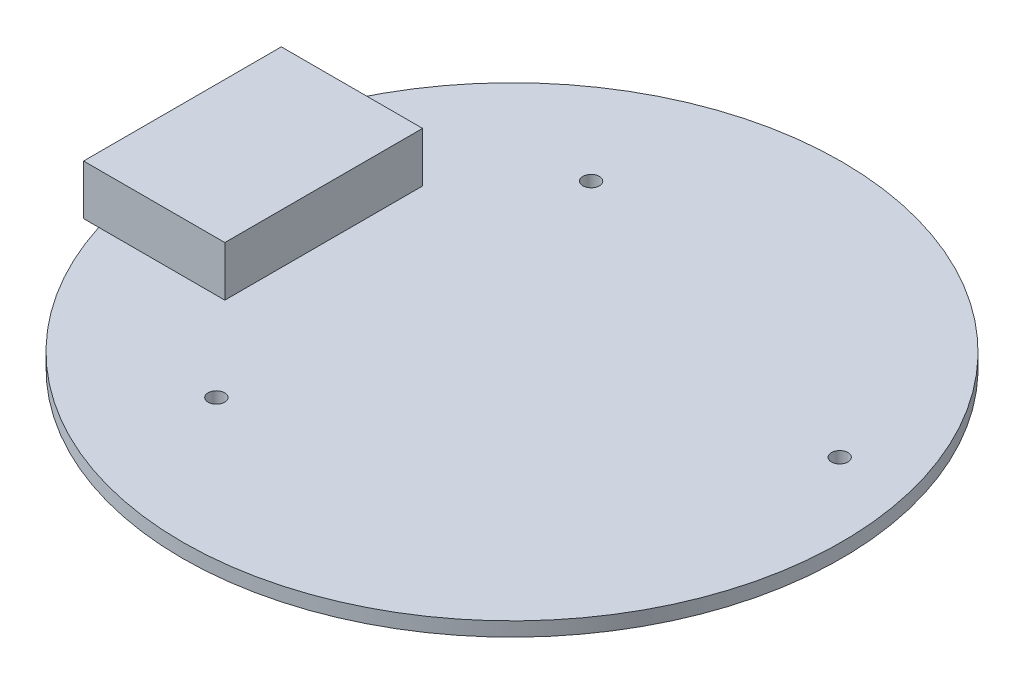
ISO-10303-21;
HEADER;
FILE_DESCRIPTION(('STEP AP214'),'2;1');
FILE_NAME('part.step','',(''),(''),'','','');
FILE_SCHEMA(('AUTOMOTIVE_DESIGN { 1 0 10303 214 1 1 1 1 }'));
ENDSEC;
DATA;
#1=APPLICATION_CONTEXT('core data for automotive mechanical design processes');
#2=APPLICATION_PROTOCOL_DEFINITION('international standard','automotive_design',2000,#1);
#3=PRODUCT_CONTEXT('',#1,'mechanical');
#4=PRODUCT('Part','Part','',(#3));
#5=PRODUCT_RELATED_PRODUCT_CATEGORY('part','',(#4));
#6=PRODUCT_DEFINITION_FORMATION('','',#4);
#7=PRODUCT_DEFINITION_CONTEXT('part definition',#1,'design');
#8=PRODUCT_DEFINITION('design','',#6,#7);
#9=PRODUCT_DEFINITION_SHAPE('','',#8);
#10=(LENGTH_UNIT() NAMED_UNIT(*) SI_UNIT(.MILLI.,.METRE.));
#11=(NAMED_UNIT(*) PLANE_ANGLE_UNIT() SI_UNIT($,.RADIAN.));
#12=(NAMED_UNIT(*) SI_UNIT($,.STERADIAN.) SOLID_ANGLE_UNIT());
#13=UNCERTAINTY_MEASURE_WITH_UNIT(LENGTH_MEASURE(1.E-05),#10,'distance_accuracy_value','');
#14=(GEOMETRIC_REPRESENTATION_CONTEXT(3) GLOBAL_UNCERTAINTY_ASSIGNED_CONTEXT((#13)) GLOBAL_UNIT_ASSIGNED_CONTEXT((#10,
#11,#12)) REPRESENTATION_CONTEXT('',''));
#15=CARTESIAN_POINT('',(0.,0.,0.));
#16=DIRECTION('',(0.,0.,1.));
#17=DIRECTION('',(1.,0.,0.));
#18=AXIS2_PLACEMENT_3D('',#15,#16,#17);
#19=CARTESIAN_POINT('',(0.,1.5,0.));
#20=DIRECTION('',(0.,-1.,0.));
#21=DIRECTION('',(0.,0.,-1.));
#22=AXIS2_PLACEMENT_3D('',#19,#20,#21);
#23=CYLINDRICAL_SURFACE('',#22,35.);
#24=CARTESIAN_POINT('',(0.,1.5,0.));
#25=DIRECTION('',(0.,1.,0.));
#26=DIRECTION('',(0.,0.,1.));
#27=AXIS2_PLACEMENT_3D('',#24,#25,#26);
#28=CIRCLE('',#27,35.);
#29=CARTESIAN_POINT('',(-33.3878720495931,1.5,-10.5));
#30=VERTEX_POINT('',#29);
#31=CARTESIAN_POINT('',(-35.,1.5,0.));
#32=VERTEX_POINT('',#31);
#33=EDGE_CURVE('E41',#30,#32,#28,.T.);
#34=ORIENTED_EDGE('',*,*,#33,.F.);
#35=CARTESIAN_POINT('',(-33.3878720495931,1.5,10.5));
#36=VERTEX_POINT('',#35);
#37=EDGE_CURVE('E106',#36,#30,#28,.T.);
#38=ORIENTED_EDGE('',*,*,#37,.F.);
#39=EDGE_CURVE('E111',#32,#36,#28,.T.);
#40=ORIENTED_EDGE('',*,*,#39,.F.);
#41=EDGE_LOOP('',(#34,#38,#40));
#42=FACE_BOUND('',#41,.T.);
#43=CARTESIAN_POINT('',(0.,0.,0.));
#44=DIRECTION('',(0.,1.,0.));
#45=DIRECTION('',(0.,0.,1.));
#46=AXIS2_PLACEMENT_3D('',#43,#44,#45);
#47=CIRCLE('',#46,35.);
#48=CARTESIAN_POINT('',(0.,0.,35.));
#49=VERTEX_POINT('',#48);
#50=EDGE_CURVE('E36',#49,#49,#47,.T.);
#51=ORIENTED_EDGE('',*,*,#50,.T.);
#52=EDGE_LOOP('',(#51));
#53=FACE_BOUND('',#52,.T.);
#54=ADVANCED_FACE('F33',(#42,#53),#23,.T.);
#55=CARTESIAN_POINT('',(0.,1.5,0.));
#56=DIRECTION('',(0.,1.,0.));
#57=DIRECTION('',(0.,0.,1.));
#58=AXIS2_PLACEMENT_3D('',#55,#56,#57);
#59=PLANE('',#58);
#60=CARTESIAN_POINT('',(-11.5,1.5,-19.9));
#61=DIRECTION('',(0.,1.,0.));
#62=DIRECTION('',(0.,0.,1.));
#63=AXIS2_PLACEMENT_3D('',#60,#61,#62);
#64=CIRCLE('',#63,0.874999999999999);
#65=CARTESIAN_POINT('',(-11.5,1.5,-19.025));
#66=VERTEX_POINT('',#65);
#67=EDGE_CURVE('E187',#66,#66,#64,.T.);
#68=ORIENTED_EDGE('',*,*,#67,.F.);
#69=EDGE_LOOP('',(#68));
#70=FACE_BOUND('',#69,.T.);
#71=CARTESIAN_POINT('',(27.1,1.5,-7.7));
#72=DIRECTION('',(0.,1.,0.));
#73=DIRECTION('',(0.,0.,1.));
#74=AXIS2_PLACEMENT_3D('',#71,#72,#73);
#75=CIRCLE('',#74,0.875000000000001);
#76=CARTESIAN_POINT('',(27.1,1.5,-6.825));
#77=VERTEX_POINT('',#76);
#78=EDGE_CURVE('E189',#77,#77,#75,.T.);
#79=ORIENTED_EDGE('',*,*,#78,.F.);
#80=EDGE_LOOP('',(#79));
#81=FACE_BOUND('',#80,.T.);
#82=CARTESIAN_POINT('',(-11.5,1.5,19.9));
#83=DIRECTION('',(0.,1.,0.));
#84=DIRECTION('',(0.,0.,1.));
#85=AXIS2_PLACEMENT_3D('',#82,#83,#84);
#86=CIRCLE('',#85,0.874999999999999);
#87=CARTESIAN_POINT('',(-11.5,1.5,20.775));
#88=VERTEX_POINT('',#87);
#89=EDGE_CURVE('E197',#88,#88,#86,.T.);
#90=ORIENTED_EDGE('',*,*,#89,.F.);
#91=EDGE_LOOP('',(#90));
#92=FACE_BOUND('',#91,.T.);
#93=DIRECTION('',(1.,0.,0.));
#94=VECTOR('',#93,1.);
#95=CARTESIAN_POINT('',(-20.,1.5,10.5));
#96=LINE('',#95,#94);
#97=CARTESIAN_POINT('',(-20.,1.5,10.5));
#98=VERTEX_POINT('',#97);
#99=EDGE_CURVE('E11',#36,#98,#96,.T.);
#100=ORIENTED_EDGE('',*,*,#99,.F.);
#101=ORIENTED_EDGE('',*,*,#37,.T.);
#102=DIRECTION('',(-1.,0.,0.));
#103=VECTOR('',#102,1.);
#104=CARTESIAN_POINT('',(-20.,1.5,-10.5));
#105=LINE('',#104,#103);
#106=CARTESIAN_POINT('',(-20.,1.5,-10.5));
#107=VERTEX_POINT('',#106);
#108=EDGE_CURVE('E54',#107,#30,#105,.T.);
#109=ORIENTED_EDGE('',*,*,#108,.F.);
#110=DIRECTION('',(0.,0.,-1.));
#111=VECTOR('',#110,1.);
#112=CARTESIAN_POINT('',(-20.,1.5,-10.5));
#113=LINE('',#112,#111);
#114=EDGE_CURVE('E50',#98,#107,#113,.T.);
#115=ORIENTED_EDGE('',*,*,#114,.F.);
#116=EDGE_LOOP('',(#100,#101,#109,#115));
#117=FACE_BOUND('',#116,.T.);
#118=ADVANCED_FACE('F118',(#70,#81,#92,#117),#59,.T.);
#119=CARTESIAN_POINT('',(0.,0.,0.));
#120=DIRECTION('',(0.,1.,0.));
#121=DIRECTION('',(0.,0.,1.));
#122=AXIS2_PLACEMENT_3D('',#119,#120,#121);
#123=PLANE('',#122);
#124=CARTESIAN_POINT('',(-11.5,0.,-19.9));
#125=DIRECTION('',(0.,1.,0.));
#126=DIRECTION('',(0.,0.,1.));
#127=AXIS2_PLACEMENT_3D('',#124,#125,#126);
#128=CIRCLE('',#127,0.874999999999999);
#129=CARTESIAN_POINT('',(-11.5,0.,-19.025));
#130=VERTEX_POINT('',#129);
#131=EDGE_CURVE('E184',#130,#130,#128,.T.);
#132=ORIENTED_EDGE('',*,*,#131,.T.);
#133=EDGE_LOOP('',(#132));
#134=FACE_BOUND('',#133,.T.);
#135=CARTESIAN_POINT('',(27.1,0.,-7.7));
#136=DIRECTION('',(0.,1.,0.));
#137=DIRECTION('',(0.,0.,1.));
#138=AXIS2_PLACEMENT_3D('',#135,#136,#137);
#139=CIRCLE('',#138,0.875000000000001);
#140=CARTESIAN_POINT('',(27.1,0.,-6.825));
#141=VERTEX_POINT('',#140);
#142=EDGE_CURVE('E194',#141,#141,#139,.T.);
#143=ORIENTED_EDGE('',*,*,#142,.T.);
#144=EDGE_LOOP('',(#143));
#145=FACE_BOUND('',#144,.T.);
#146=CARTESIAN_POINT('',(-11.5,0.,19.9));
#147=DIRECTION('',(0.,1.,0.));
#148=DIRECTION('',(0.,0.,1.));
#149=AXIS2_PLACEMENT_3D('',#146,#147,#148);
#150=CIRCLE('',#149,0.874999999999999);
#151=CARTESIAN_POINT('',(-11.5,0.,20.775));
#152=VERTEX_POINT('',#151);
#153=EDGE_CURVE('E200',#152,#152,#150,.T.);
#154=ORIENTED_EDGE('',*,*,#153,.T.);
#155=EDGE_LOOP('',(#154));
#156=FACE_BOUND('',#155,.T.);
#157=ORIENTED_EDGE('',*,*,#50,.F.);
#158=EDGE_LOOP('',(#157));
#159=FACE_BOUND('',#158,.T.);
#160=ADVANCED_FACE('F144',(#134,#145,#156,#159),#123,.F.);
#161=CARTESIAN_POINT('',(0.,1.5,0.));
#162=DIRECTION('',(0.,-1.,0.));
#163=DIRECTION('',(0.,0.,-1.));
#164=AXIS2_PLACEMENT_3D('',#161,#162,#163);
#165=PLANE('',#164);
#166=CARTESIAN_POINT('',(-35.,1.5,-10.5));
#167=VERTEX_POINT('',#166);
#168=EDGE_CURVE('E120',#30,#167,#105,.T.);
#169=ORIENTED_EDGE('',*,*,#168,.F.);
#170=ORIENTED_EDGE('',*,*,#33,.T.);
#171=DIRECTION('',(0.,0.,1.));
#172=VECTOR('',#171,1.);
#173=CARTESIAN_POINT('',(-35.,1.5,-10.5));
#174=LINE('',#173,#172);
#175=EDGE_CURVE('E123',#167,#32,#174,.T.);
#176=ORIENTED_EDGE('',*,*,#175,.F.);
#177=EDGE_LOOP('',(#169,#170,#176));
#178=FACE_BOUND('',#177,.T.);
#179=ADVANCED_FACE('F121',(#178),#165,.T.);
#180=CARTESIAN_POINT('',(-20.,6.8,-10.5));
#181=DIRECTION('',(-1.,0.,0.));
#182=DIRECTION('',(0.,0.,1.));
#183=AXIS2_PLACEMENT_3D('',#180,#181,#182);
#184=PLANE('',#183);
#185=ORIENTED_EDGE('',*,*,#114,.T.);
#186=DIRECTION('',(0.,-1.,0.));
#187=VECTOR('',#186,1.);
#188=CARTESIAN_POINT('',(-20.,6.8,-10.5));
#189=LINE('',#188,#187);
#190=CARTESIAN_POINT('',(-20.,6.8,-10.5));
#191=VERTEX_POINT('',#190);
#192=EDGE_CURVE('E87',#191,#107,#189,.T.);
#193=ORIENTED_EDGE('',*,*,#192,.F.);
#194=DIRECTION('',(0.,0.,-1.));
#195=VECTOR('',#194,1.);
#196=CARTESIAN_POINT('',(-20.,6.8,-10.5));
#197=LINE('',#196,#195);
#198=CARTESIAN_POINT('',(-20.,6.8,10.5));
#199=VERTEX_POINT('',#198);
#200=EDGE_CURVE('E93',#199,#191,#197,.T.);
#201=ORIENTED_EDGE('',*,*,#200,.F.);
#202=DIRECTION('',(0.,-1.,0.));
#203=VECTOR('',#202,1.);
#204=CARTESIAN_POINT('',(-20.,6.8,10.5));
#205=LINE('',#204,#203);
#206=EDGE_CURVE('E131',#199,#98,#205,.T.);
#207=ORIENTED_EDGE('',*,*,#206,.T.);
#208=EDGE_LOOP('',(#185,#193,#201,#207));
#209=FACE_BOUND('',#208,.T.);
#210=ADVANCED_FACE('F103',(#209),#184,.F.);
#211=CARTESIAN_POINT('',(-20.,6.8,-10.5));
#212=DIRECTION('',(0.,0.,1.));
#213=DIRECTION('',(1.,0.,0.));
#214=AXIS2_PLACEMENT_3D('',#211,#212,#213);
#215=PLANE('',#214);
#216=ORIENTED_EDGE('',*,*,#108,.T.);
#217=ORIENTED_EDGE('',*,*,#168,.T.);
#218=DIRECTION('',(0.,-1.,0.));
#219=VECTOR('',#218,1.);
#220=CARTESIAN_POINT('',(-35.,6.8,-10.5));
#221=LINE('',#220,#219);
#222=CARTESIAN_POINT('',(-35.,6.8,-10.5));
#223=VERTEX_POINT('',#222);
#224=EDGE_CURVE('E89',#223,#167,#221,.T.);
#225=ORIENTED_EDGE('',*,*,#224,.F.);
#226=DIRECTION('',(-1.,0.,0.));
#227=VECTOR('',#226,1.);
#228=CARTESIAN_POINT('',(-20.,6.8,-10.5));
#229=LINE('',#228,#227);
#230=EDGE_CURVE('E83',#191,#223,#229,.T.);
#231=ORIENTED_EDGE('',*,*,#230,.F.);
#232=ORIENTED_EDGE('',*,*,#192,.T.);
#233=EDGE_LOOP('',(#216,#217,#225,#231,#232));
#234=FACE_BOUND('',#233,.T.);
#235=ADVANCED_FACE('F85',(#234),#215,.F.);
#236=CARTESIAN_POINT('',(-35.,6.8,-10.5));
#237=DIRECTION('',(1.,0.,0.));
#238=DIRECTION('',(0.,0.,-1.));
#239=AXIS2_PLACEMENT_3D('',#236,#237,#238);
#240=PLANE('',#239);
#241=ORIENTED_EDGE('',*,*,#175,.T.);
#242=CARTESIAN_POINT('',(-35.,1.5,10.5));
#243=VERTEX_POINT('',#242);
#244=EDGE_CURVE('E125',#32,#243,#174,.T.);
#245=ORIENTED_EDGE('',*,*,#244,.T.);
#246=DIRECTION('',(0.,-1.,0.));
#247=VECTOR('',#246,1.);
#248=CARTESIAN_POINT('',(-35.,6.8,10.5));
#249=LINE('',#248,#247);
#250=CARTESIAN_POINT('',(-35.,6.8,10.5));
#251=VERTEX_POINT('',#250);
#252=EDGE_CURVE('E107',#251,#243,#249,.T.);
#253=ORIENTED_EDGE('',*,*,#252,.F.);
#254=DIRECTION('',(0.,0.,1.));
#255=VECTOR('',#254,1.);
#256=CARTESIAN_POINT('',(-35.,6.8,-10.5));
#257=LINE('',#256,#255);
#258=EDGE_CURVE('E92',#223,#251,#257,.T.);
#259=ORIENTED_EDGE('',*,*,#258,.F.);
#260=ORIENTED_EDGE('',*,*,#224,.T.);
#261=EDGE_LOOP('',(#241,#245,#253,#259,#260));
#262=FACE_BOUND('',#261,.T.);
#263=ADVANCED_FACE('F161',(#262),#240,.F.);
#264=CARTESIAN_POINT('',(-20.,6.8,10.5));
#265=DIRECTION('',(0.,0.,-1.));
#266=DIRECTION('',(-1.,0.,0.));
#267=AXIS2_PLACEMENT_3D('',#264,#265,#266);
#268=PLANE('',#267);
#269=EDGE_CURVE('E43',#243,#36,#96,.T.);
#270=ORIENTED_EDGE('',*,*,#269,.T.);
#271=ORIENTED_EDGE('',*,*,#99,.T.);
#272=ORIENTED_EDGE('',*,*,#206,.F.);
#273=DIRECTION('',(1.,0.,0.));
#274=VECTOR('',#273,1.);
#275=CARTESIAN_POINT('',(-20.,6.8,10.5));
#276=LINE('',#275,#274);
#277=EDGE_CURVE('E98',#251,#199,#276,.T.);
#278=ORIENTED_EDGE('',*,*,#277,.F.);
#279=ORIENTED_EDGE('',*,*,#252,.T.);
#280=EDGE_LOOP('',(#270,#271,#272,#278,#279));
#281=FACE_BOUND('',#280,.T.);
#282=ADVANCED_FACE('F136',(#281),#268,.F.);
#283=CARTESIAN_POINT('',(0.,6.8,0.));
#284=DIRECTION('',(0.,-1.,0.));
#285=DIRECTION('',(0.,0.,-1.));
#286=AXIS2_PLACEMENT_3D('',#283,#284,#285);
#287=PLANE('',#286);
#288=ORIENTED_EDGE('',*,*,#200,.T.);
#289=ORIENTED_EDGE('',*,*,#230,.T.);
#290=ORIENTED_EDGE('',*,*,#258,.T.);
#291=ORIENTED_EDGE('',*,*,#277,.T.);
#292=EDGE_LOOP('',(#288,#289,#290,#291));
#293=FACE_BOUND('',#292,.T.);
#294=ADVANCED_FACE('F96',(#293),#287,.F.);
#295=ORIENTED_EDGE('',*,*,#244,.F.);
#296=ORIENTED_EDGE('',*,*,#39,.T.);
#297=ORIENTED_EDGE('',*,*,#269,.F.);
#298=EDGE_LOOP('',(#295,#296,#297));
#299=FACE_BOUND('',#298,.T.);
#300=ADVANCED_FACE('F139',(#299),#165,.T.);
#301=CARTESIAN_POINT('',(-11.5,1.5,19.9));
#302=DIRECTION('',(0.,1.,0.));
#303=DIRECTION('',(0.,0.,1.));
#304=AXIS2_PLACEMENT_3D('',#301,#302,#303);
#305=CYLINDRICAL_SURFACE('',#304,0.874999999999999);
#306=ORIENTED_EDGE('',*,*,#153,.F.);
#307=EDGE_LOOP('',(#306));
#308=FACE_BOUND('',#307,.T.);
#309=ORIENTED_EDGE('',*,*,#89,.T.);
#310=EDGE_LOOP('',(#309));
#311=FACE_BOUND('',#310,.T.);
#312=ADVANCED_FACE('F167',(#308,#311),#305,.F.);
#313=CARTESIAN_POINT('',(27.1,1.5,-7.7));
#314=DIRECTION('',(0.,1.,0.));
#315=DIRECTION('',(0.,0.,1.));
#316=AXIS2_PLACEMENT_3D('',#313,#314,#315);
#317=CYLINDRICAL_SURFACE('',#316,0.875000000000001);
#318=ORIENTED_EDGE('',*,*,#142,.F.);
#319=EDGE_LOOP('',(#318));
#320=FACE_BOUND('',#319,.T.);
#321=ORIENTED_EDGE('',*,*,#78,.T.);
#322=EDGE_LOOP('',(#321));
#323=FACE_BOUND('',#322,.T.);
#324=ADVANCED_FACE('F172',(#320,#323),#317,.F.);
#325=CARTESIAN_POINT('',(-11.5,1.5,-19.9));
#326=DIRECTION('',(0.,1.,0.));
#327=DIRECTION('',(0.,0.,1.));
#328=AXIS2_PLACEMENT_3D('',#325,#326,#327);
#329=CYLINDRICAL_SURFACE('',#328,0.874999999999999);
#330=ORIENTED_EDGE('',*,*,#131,.F.);
#331=EDGE_LOOP('',(#330));
#332=FACE_BOUND('',#331,.T.);
#333=ORIENTED_EDGE('',*,*,#67,.T.);
#334=EDGE_LOOP('',(#333));
#335=FACE_BOUND('',#334,.T.);
#336=ADVANCED_FACE('F176',(#332,#335),#329,.F.);
#337=CLOSED_SHELL('',(#54,#118,#160,#179,#210,#235,#263,#282,#294,#300,#312,#324,#336));
#338=MANIFOLD_SOLID_BREP('B2',#337);
#339=ADVANCED_BREP_SHAPE_REPRESENTATION('',(#18,#338),#14);
#340=SHAPE_DEFINITION_REPRESENTATION(#9,#339);
ENDSEC;
END-ISO-10303-21;
